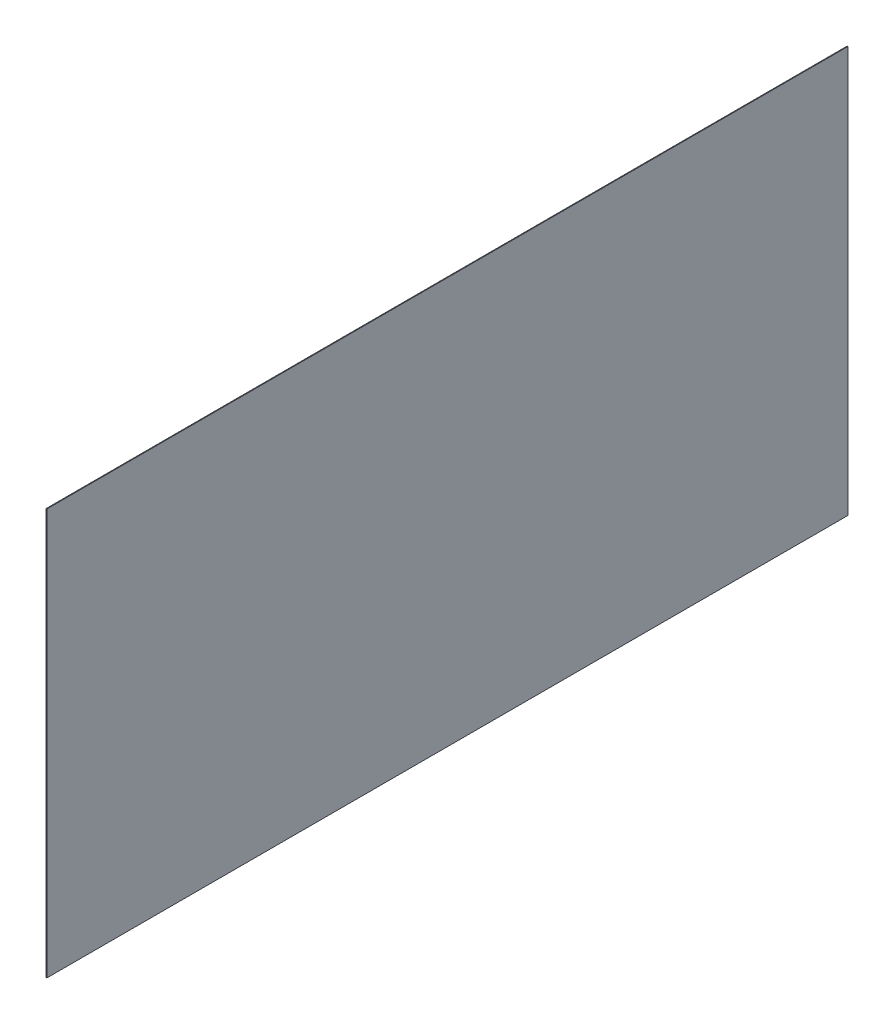
ISO-10303-21;
HEADER;
FILE_DESCRIPTION(('STEP AP214'),'2;1');
FILE_NAME('part.step','',(''),(''),'','','');
FILE_SCHEMA(('AUTOMOTIVE_DESIGN { 1 0 10303 214 1 1 1 1 }'));
ENDSEC;
DATA;
#1=APPLICATION_CONTEXT('core data for automotive mechanical design processes');
#2=APPLICATION_PROTOCOL_DEFINITION('international standard','automotive_design',2000,#1);
#3=PRODUCT_CONTEXT('',#1,'mechanical');
#4=PRODUCT('Part','Part','',(#3));
#5=PRODUCT_RELATED_PRODUCT_CATEGORY('part','',(#4));
#6=PRODUCT_DEFINITION_FORMATION('','',#4);
#7=PRODUCT_DEFINITION_CONTEXT('part definition',#1,'design');
#8=PRODUCT_DEFINITION('design','',#6,#7);
#9=PRODUCT_DEFINITION_SHAPE('','',#8);
#10=(LENGTH_UNIT() NAMED_UNIT(*) SI_UNIT(.MILLI.,.METRE.));
#11=(NAMED_UNIT(*) PLANE_ANGLE_UNIT() SI_UNIT($,.RADIAN.));
#12=(NAMED_UNIT(*) SI_UNIT($,.STERADIAN.) SOLID_ANGLE_UNIT());
#13=UNCERTAINTY_MEASURE_WITH_UNIT(LENGTH_MEASURE(1.E-05),#10,'distance_accuracy_value','');
#14=(GEOMETRIC_REPRESENTATION_CONTEXT(3) GLOBAL_UNCERTAINTY_ASSIGNED_CONTEXT((#13)) GLOBAL_UNIT_ASSIGNED_CONTEXT((#10,
#11,#12)) REPRESENTATION_CONTEXT('',''));
#15=CARTESIAN_POINT('',(0.,0.,0.));
#16=DIRECTION('',(0.,0.,1.));
#17=DIRECTION('',(1.,0.,0.));
#18=AXIS2_PLACEMENT_3D('',#15,#16,#17);
#19=CARTESIAN_POINT('',(-124.110999999927,-59.9999999998948,150.000000000042));
#20=DIRECTION('',(1.18292683688206E-10,-1.,0.));
#21=DIRECTION('',(1.,1.18292683688206E-10,0.));
#22=AXIS2_PLACEMENT_3D('',#19,#20,#21);
#23=PLANE('',#22);
#24=DIRECTION('',(-1.,-1.18292683702427E-10,-4.73167801227375E-11));
#25=VECTOR('',#24,1.);
#26=CARTESIAN_POINT('',(-114.110999996189,-59.9999999987119,70.9999999946006));
#27=LINE('',#26,#25);
#28=CARTESIAN_POINT('',(-123.984000000447,-59.9999999998798,70.9999999941335));
#29=VERTEX_POINT('',#28);
#30=CARTESIAN_POINT('',(-124.110999996189,-59.9999999998948,70.9999999941275));
#31=VERTEX_POINT('',#30);
#32=EDGE_CURVE('E65',#29,#31,#27,.T.);
#33=ORIENTED_EDGE('',*,*,#32,.T.);
#34=DIRECTION('',(4.73167801227375E-11,0.,-1.));
#35=VECTOR('',#34,1.);
#36=CARTESIAN_POINT('',(-124.110999999927,-59.9999999998948,150.000000000042));
#37=LINE('',#36,#35);
#38=CARTESIAN_POINT('',(-124.11099998947,-59.9999999998948,-71.0000000058725));
#39=VERTEX_POINT('',#38);
#40=EDGE_CURVE('E97',#31,#39,#37,.T.);
#41=ORIENTED_EDGE('',*,*,#40,.T.);
#42=DIRECTION('',(-1.,-1.18292683702427E-10,-4.73167801227375E-11));
#43=VECTOR('',#42,1.);
#44=CARTESIAN_POINT('',(-114.11099998947,-59.9999999987119,-71.0000000053994));
#45=LINE('',#44,#43);
#46=CARTESIAN_POINT('',(-123.983999987601,-59.9999999998798,-71.0000000058665));
#47=VERTEX_POINT('',#46);
#48=EDGE_CURVE('E80',#47,#39,#45,.T.);
#49=ORIENTED_EDGE('',*,*,#48,.F.);
#50=DIRECTION('',(4.73167801227375E-11,0.,-1.));
#51=VECTOR('',#50,1.);
#52=CARTESIAN_POINT('',(-123.983999999927,-59.9999999998798,150.000000000048));
#53=LINE('',#52,#51);
#54=EDGE_CURVE('E101',#29,#47,#53,.T.);
#55=ORIENTED_EDGE('',*,*,#54,.F.);
#56=EDGE_LOOP('',(#33,#41,#49,#55));
#57=FACE_BOUND('',#56,.T.);
#58=ADVANCED_FACE('F43',(#57),#23,.T.);
#59=CARTESIAN_POINT('',(-124.110999999927,-1.46814232669815E-08,-5.87253289780961E-09));
#60=DIRECTION('',(-1.,-1.18292683702427E-10,-4.73167801227375E-11));
#61=DIRECTION('',(1.18292683702427E-10,-1.,0.));
#62=AXIS2_PLACEMENT_3D('',#59,#60,#61);
#63=PLANE('',#62);
#64=DIRECTION('',(1.18292721297387E-10,-1.,0.));
#65=VECTOR('',#64,1.);
#66=CARTESIAN_POINT('',(-124.111000004706,12.0000000001052,70.9999999941275));
#67=LINE('',#66,#65);
#68=CARTESIAN_POINT('',(-124.111000004706,12.0000000001052,70.9999999941275));
#69=VERTEX_POINT('',#68);
#70=EDGE_CURVE('E91',#69,#31,#67,.T.);
#71=ORIENTED_EDGE('',*,*,#70,.F.);
#72=DIRECTION('',(-4.73168061852437E-11,0.,1.));
#73=VECTOR('',#72,1.);
#74=CARTESIAN_POINT('',(-124.110999997987,12.0000000001052,-71.0000000058725));
#75=LINE('',#74,#73);
#76=CARTESIAN_POINT('',(-124.110999997987,12.0000000001052,-71.0000000058725));
#77=VERTEX_POINT('',#76);
#78=EDGE_CURVE('E99',#77,#69,#75,.T.);
#79=ORIENTED_EDGE('',*,*,#78,.F.);
#80=DIRECTION('',(-1.18292721297387E-10,1.,0.));
#81=VECTOR('',#80,1.);
#82=CARTESIAN_POINT('',(-124.11099998947,-59.9999999998948,-71.0000000058725));
#83=LINE('',#82,#81);
#84=EDGE_CURVE('E83',#39,#77,#83,.T.);
#85=ORIENTED_EDGE('',*,*,#84,.F.);
#86=ORIENTED_EDGE('',*,*,#40,.F.);
#87=EDGE_LOOP('',(#71,#79,#85,#86));
#88=FACE_BOUND('',#87,.T.);
#89=ADVANCED_FACE('F96',(#88),#63,.T.);
#90=CARTESIAN_POINT('',(-123.983999999927,-1.46664000961531E-08,-5.86652366673402E-09));
#91=DIRECTION('',(-1.,-1.18292683702427E-10,-4.73167801227375E-11));
#92=DIRECTION('',(1.18292683702427E-10,-1.,0.));
#93=AXIS2_PLACEMENT_3D('',#90,#91,#92);
#94=PLANE('',#93);
#95=DIRECTION('',(-4.73167801227375E-11,0.,1.));
#96=VECTOR('',#95,1.);
#97=CARTESIAN_POINT('',(-123.984000001346,12.0000000001202,-5.86652513276469E-09));
#98=LINE('',#97,#96);
#99=CARTESIAN_POINT('',(-123.983999997987,12.0000000012881,-71.0000000058665));
#100=VERTEX_POINT('',#99);
#101=CARTESIAN_POINT('',(-123.984000001346,12.0000000001202,70.9999999941335));
#102=VERTEX_POINT('',#101);
#103=EDGE_CURVE('E50',#100,#102,#98,.T.);
#104=ORIENTED_EDGE('',*,*,#103,.T.);
#105=DIRECTION('',(1.18292683702427E-10,-1.,0.));
#106=VECTOR('',#105,1.);
#107=CARTESIAN_POINT('',(-123.984000003286,-1.46664000965505E-08,70.9999999941335));
#108=LINE('',#107,#106);
#109=EDGE_CURVE('E11',#102,#29,#108,.T.);
#110=ORIENTED_EDGE('',*,*,#109,.T.);
#111=ORIENTED_EDGE('',*,*,#54,.T.);
#112=DIRECTION('',(-1.18292683702427E-10,1.,0.));
#113=VECTOR('',#112,1.);
#114=CARTESIAN_POINT('',(-123.983999996567,-1.46664000957557E-08,-71.0000000058665));
#115=LINE('',#114,#113);
#116=EDGE_CURVE('E86',#47,#100,#115,.T.);
#117=ORIENTED_EDGE('',*,*,#116,.T.);
#118=EDGE_LOOP('',(#104,#110,#111,#117));
#119=FACE_BOUND('',#118,.T.);
#120=ADVANCED_FACE('F108',(#119),#94,.F.);
#121=CARTESIAN_POINT('',(-114.111000004706,12.0000000012881,70.9999999946006));
#122=DIRECTION('',(4.73167801227375E-11,0.,-1.));
#123=DIRECTION('',(-1.,0.,-4.73167801227375E-11));
#124=AXIS2_PLACEMENT_3D('',#121,#122,#123);
#125=PLANE('',#124);
#126=DIRECTION('',(-1.,-1.18292683702427E-10,-4.73167801227375E-11));
#127=VECTOR('',#126,1.);
#128=CARTESIAN_POINT('',(-114.111000004706,12.0000000012881,70.9999999946006));
#129=LINE('',#128,#127);
#130=EDGE_CURVE('E112',#102,#69,#129,.T.);
#131=ORIENTED_EDGE('',*,*,#130,.T.);
#132=ORIENTED_EDGE('',*,*,#70,.T.);
#133=ORIENTED_EDGE('',*,*,#32,.F.);
#134=ORIENTED_EDGE('',*,*,#109,.F.);
#135=EDGE_LOOP('',(#131,#132,#133,#134));
#136=FACE_BOUND('',#135,.T.);
#137=ADVANCED_FACE('F117',(#136),#125,.F.);
#138=CARTESIAN_POINT('',(-114.110999997987,12.0000000012881,-71.0000000053994));
#139=DIRECTION('',(1.18292683702427E-10,-1.,0.));
#140=DIRECTION('',(1.,1.18292683702427E-10,0.));
#141=AXIS2_PLACEMENT_3D('',#138,#139,#140);
#142=PLANE('',#141);
#143=DIRECTION('',(-1.,-1.18292683702427E-10,-4.73167801227375E-11));
#144=VECTOR('',#143,1.);
#145=CARTESIAN_POINT('',(-114.110999997987,12.0000000012881,-71.0000000053994));
#146=LINE('',#145,#144);
#147=EDGE_CURVE('E57',#100,#77,#146,.T.);
#148=ORIENTED_EDGE('',*,*,#147,.T.);
#149=ORIENTED_EDGE('',*,*,#78,.T.);
#150=ORIENTED_EDGE('',*,*,#130,.F.);
#151=ORIENTED_EDGE('',*,*,#103,.F.);
#152=EDGE_LOOP('',(#148,#149,#150,#151));
#153=FACE_BOUND('',#152,.T.);
#154=ADVANCED_FACE('F111',(#153),#142,.F.);
#155=CARTESIAN_POINT('',(-114.11099998947,-59.9999999987119,-71.0000000053994));
#156=DIRECTION('',(-4.73167801227375E-11,0.,1.));
#157=DIRECTION('',(1.,0.,4.73167801227375E-11));
#158=AXIS2_PLACEMENT_3D('',#155,#156,#157);
#159=PLANE('',#158);
#160=ORIENTED_EDGE('',*,*,#48,.T.);
#161=ORIENTED_EDGE('',*,*,#84,.T.);
#162=ORIENTED_EDGE('',*,*,#147,.F.);
#163=ORIENTED_EDGE('',*,*,#116,.F.);
#164=EDGE_LOOP('',(#160,#161,#162,#163));
#165=FACE_BOUND('',#164,.T.);
#166=ADVANCED_FACE('F82',(#165),#159,.F.);
#167=CLOSED_SHELL('',(#58,#89,#120,#137,#154,#166));
#168=MANIFOLD_SOLID_BREP('B2',#167);
#169=ADVANCED_BREP_SHAPE_REPRESENTATION('',(#18,#168),#14);
#170=SHAPE_DEFINITION_REPRESENTATION(#9,#169);
ENDSEC;
END-ISO-10303-21;
